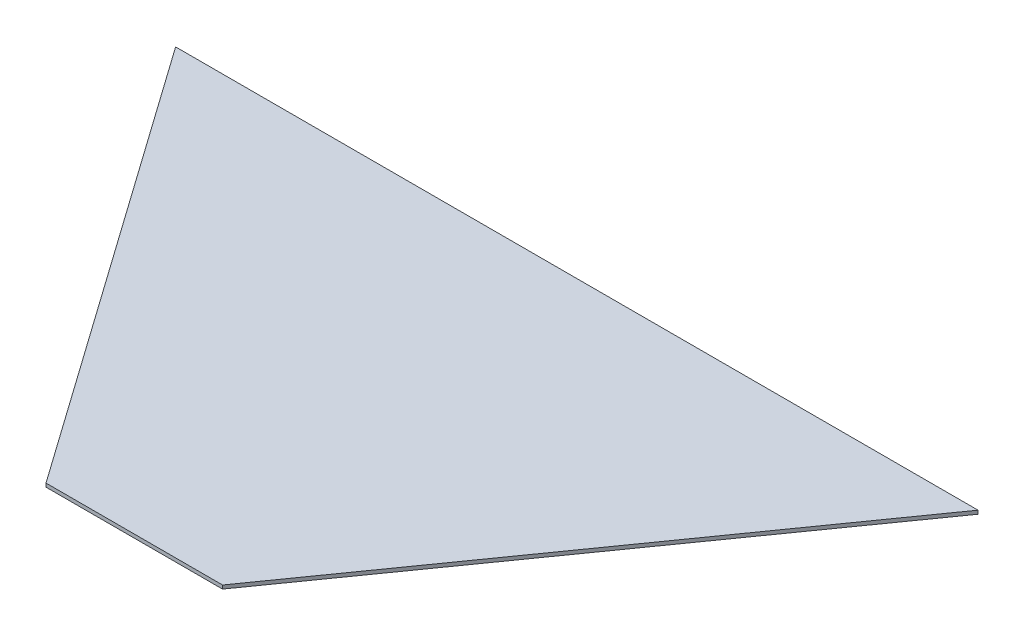
ISO-10303-21;
HEADER;
FILE_DESCRIPTION(('STEP AP214'),'2;1');
FILE_NAME('part.step','',(''),(''),'','','');
FILE_SCHEMA(('AUTOMOTIVE_DESIGN { 1 0 10303 214 1 1 1 1 }'));
ENDSEC;
DATA;
#1=APPLICATION_CONTEXT('core data for automotive mechanical design processes');
#2=APPLICATION_PROTOCOL_DEFINITION('international standard','automotive_design',2000,#1);
#3=PRODUCT_CONTEXT('',#1,'mechanical');
#4=PRODUCT('Part','Part','',(#3));
#5=PRODUCT_RELATED_PRODUCT_CATEGORY('part','',(#4));
#6=PRODUCT_DEFINITION_FORMATION('','',#4);
#7=PRODUCT_DEFINITION_CONTEXT('part definition',#1,'design');
#8=PRODUCT_DEFINITION('design','',#6,#7);
#9=PRODUCT_DEFINITION_SHAPE('','',#8);
#10=(LENGTH_UNIT() NAMED_UNIT(*) SI_UNIT(.MILLI.,.METRE.));
#11=(NAMED_UNIT(*) PLANE_ANGLE_UNIT() SI_UNIT($,.RADIAN.));
#12=(NAMED_UNIT(*) SI_UNIT($,.STERADIAN.) SOLID_ANGLE_UNIT());
#13=UNCERTAINTY_MEASURE_WITH_UNIT(LENGTH_MEASURE(1.E-05),#10,'distance_accuracy_value','');
#14=(GEOMETRIC_REPRESENTATION_CONTEXT(3) GLOBAL_UNCERTAINTY_ASSIGNED_CONTEXT((#13)) GLOBAL_UNIT_ASSIGNED_CONTEXT((#10,
#11,#12)) REPRESENTATION_CONTEXT('',''));
#15=CARTESIAN_POINT('',(0.,0.,0.));
#16=DIRECTION('',(0.,0.,1.));
#17=DIRECTION('',(1.,0.,0.));
#18=AXIS2_PLACEMENT_3D('',#15,#16,#17);
#19=CARTESIAN_POINT('',(168.110535,1.5,-185.436900746406));
#20=DIRECTION('',(-0.816496580927726,0.,-0.577350269189626));
#21=DIRECTION('',(-0.577350269189626,0.,0.816496580927726));
#22=AXIS2_PLACEMENT_3D('',#19,#20,#21);
#23=PLANE('',#22);
#24=DIRECTION('',(0.577350269189626,0.,-0.816496580927726));
#25=VECTOR('',#24,1.);
#26=CARTESIAN_POINT('',(168.110535,0.,-185.436900746406));
#27=LINE('',#26,#25);
#28=CARTESIAN_POINT('',(36.986845,0.,0.));
#29=VERTEX_POINT('',#28);
#30=CARTESIAN_POINT('',(168.110535,0.,-185.436900746406));
#31=VERTEX_POINT('',#30);
#32=EDGE_CURVE('E110',#29,#31,#27,.T.);
#33=ORIENTED_EDGE('',*,*,#32,.T.);
#34=DIRECTION('',(0.,-1.,0.));
#35=VECTOR('',#34,1.);
#36=CARTESIAN_POINT('',(168.110535,1.5,-185.436900746406));
#37=LINE('',#36,#35);
#38=CARTESIAN_POINT('',(168.110535,1.5,-185.436900746406));
#39=VERTEX_POINT('',#38);
#40=EDGE_CURVE('E11',#39,#31,#37,.T.);
#41=ORIENTED_EDGE('',*,*,#40,.F.);
#42=DIRECTION('',(0.577350269189626,0.,-0.816496580927726));
#43=VECTOR('',#42,1.);
#44=CARTESIAN_POINT('',(168.110535,1.5,-185.436900746406));
#45=LINE('',#44,#43);
#46=CARTESIAN_POINT('',(36.986845,1.5,0.));
#47=VERTEX_POINT('',#46);
#48=EDGE_CURVE('E93',#47,#39,#45,.T.);
#49=ORIENTED_EDGE('',*,*,#48,.F.);
#50=DIRECTION('',(0.,-1.,0.));
#51=VECTOR('',#50,1.);
#52=CARTESIAN_POINT('',(36.986845,1.5,0.));
#53=LINE('',#52,#51);
#54=EDGE_CURVE('E106',#47,#29,#53,.T.);
#55=ORIENTED_EDGE('',*,*,#54,.T.);
#56=EDGE_LOOP('',(#33,#41,#49,#55));
#57=FACE_BOUND('',#56,.T.);
#58=ADVANCED_FACE('F41',(#57),#23,.F.);
#59=CARTESIAN_POINT('',(168.110535,1.5,-185.436900746406));
#60=DIRECTION('',(0.,0.,1.));
#61=DIRECTION('',(1.,0.,0.));
#62=AXIS2_PLACEMENT_3D('',#59,#60,#61);
#63=PLANE('',#62);
#64=DIRECTION('',(-1.,0.,0.));
#65=VECTOR('',#64,1.);
#66=CARTESIAN_POINT('',(168.110535,0.,-185.436900746406));
#67=LINE('',#66,#65);
#68=CARTESIAN_POINT('',(-168.110535,0.,-185.436900746405));
#69=VERTEX_POINT('',#68);
#70=EDGE_CURVE('E98',#31,#69,#67,.T.);
#71=ORIENTED_EDGE('',*,*,#70,.T.);
#72=DIRECTION('',(0.,-1.,0.));
#73=VECTOR('',#72,1.);
#74=CARTESIAN_POINT('',(-168.110535,1.5,-185.436900746405));
#75=LINE('',#74,#73);
#76=CARTESIAN_POINT('',(-168.110535,1.5,-185.436900746405));
#77=VERTEX_POINT('',#76);
#78=EDGE_CURVE('E50',#77,#69,#75,.T.);
#79=ORIENTED_EDGE('',*,*,#78,.F.);
#80=DIRECTION('',(-1.,0.,0.));
#81=VECTOR('',#80,1.);
#82=CARTESIAN_POINT('',(168.110535,1.5,-185.436900746406));
#83=LINE('',#82,#81);
#84=EDGE_CURVE('E88',#39,#77,#83,.T.);
#85=ORIENTED_EDGE('',*,*,#84,.F.);
#86=ORIENTED_EDGE('',*,*,#40,.T.);
#87=EDGE_LOOP('',(#71,#79,#85,#86));
#88=FACE_BOUND('',#87,.T.);
#89=ADVANCED_FACE('F97',(#88),#63,.F.);
#90=CARTESIAN_POINT('',(-168.110535,1.5,-185.436900746405));
#91=DIRECTION('',(0.816496580927726,0.,-0.577350269189626));
#92=DIRECTION('',(-0.577350269189626,0.,-0.816496580927726));
#93=AXIS2_PLACEMENT_3D('',#90,#91,#92);
#94=PLANE('',#93);
#95=DIRECTION('',(0.577350269189626,0.,0.816496580927726));
#96=VECTOR('',#95,1.);
#97=CARTESIAN_POINT('',(-168.110535,0.,-185.436900746405));
#98=LINE('',#97,#96);
#99=CARTESIAN_POINT('',(-36.986845,0.,0.));
#100=VERTEX_POINT('',#99);
#101=EDGE_CURVE('E75',#69,#100,#98,.T.);
#102=ORIENTED_EDGE('',*,*,#101,.T.);
#103=DIRECTION('',(0.,-1.,0.));
#104=VECTOR('',#103,1.);
#105=CARTESIAN_POINT('',(-36.986845,1.5,0.));
#106=LINE('',#105,#104);
#107=CARTESIAN_POINT('',(-36.986845,1.5,0.));
#108=VERTEX_POINT('',#107);
#109=EDGE_CURVE('E100',#108,#100,#106,.T.);
#110=ORIENTED_EDGE('',*,*,#109,.F.);
#111=DIRECTION('',(0.577350269189626,0.,0.816496580927726));
#112=VECTOR('',#111,1.);
#113=CARTESIAN_POINT('',(-168.110535,1.5,-185.436900746405));
#114=LINE('',#113,#112);
#115=EDGE_CURVE('E91',#77,#108,#114,.T.);
#116=ORIENTED_EDGE('',*,*,#115,.F.);
#117=ORIENTED_EDGE('',*,*,#78,.T.);
#118=EDGE_LOOP('',(#102,#110,#116,#117));
#119=FACE_BOUND('',#118,.T.);
#120=ADVANCED_FACE('F101',(#119),#94,.F.);
#121=CARTESIAN_POINT('',(36.986845,1.5,0.));
#122=DIRECTION('',(0.,0.,-1.));
#123=DIRECTION('',(-1.,0.,0.));
#124=AXIS2_PLACEMENT_3D('',#121,#122,#123);
#125=PLANE('',#124);
#126=DIRECTION('',(1.,0.,0.));
#127=VECTOR('',#126,1.);
#128=CARTESIAN_POINT('',(36.986845,0.,0.));
#129=LINE('',#128,#127);
#130=EDGE_CURVE('E81',#100,#29,#129,.T.);
#131=ORIENTED_EDGE('',*,*,#130,.T.);
#132=ORIENTED_EDGE('',*,*,#54,.F.);
#133=DIRECTION('',(1.,0.,0.));
#134=VECTOR('',#133,1.);
#135=CARTESIAN_POINT('',(36.986845,1.5,0.));
#136=LINE('',#135,#134);
#137=EDGE_CURVE('E58',#108,#47,#136,.T.);
#138=ORIENTED_EDGE('',*,*,#137,.F.);
#139=ORIENTED_EDGE('',*,*,#109,.T.);
#140=EDGE_LOOP('',(#131,#132,#138,#139));
#141=FACE_BOUND('',#140,.T.);
#142=ADVANCED_FACE('F124',(#141),#125,.F.);
#143=CARTESIAN_POINT('',(0.,1.5,0.));
#144=DIRECTION('',(0.,1.,0.));
#145=DIRECTION('',(0.,0.,1.));
#146=AXIS2_PLACEMENT_3D('',#143,#144,#145);
#147=PLANE('',#146);
#148=ORIENTED_EDGE('',*,*,#48,.T.);
#149=ORIENTED_EDGE('',*,*,#84,.T.);
#150=ORIENTED_EDGE('',*,*,#115,.T.);
#151=ORIENTED_EDGE('',*,*,#137,.T.);
#152=EDGE_LOOP('',(#148,#149,#150,#151));
#153=FACE_BOUND('',#152,.T.);
#154=ADVANCED_FACE('F89',(#153),#147,.T.);
#155=CARTESIAN_POINT('',(0.,0.,0.));
#156=DIRECTION('',(0.,1.,0.));
#157=DIRECTION('',(0.,0.,1.));
#158=AXIS2_PLACEMENT_3D('',#155,#156,#157);
#159=PLANE('',#158);
#160=ORIENTED_EDGE('',*,*,#32,.F.);
#161=ORIENTED_EDGE('',*,*,#130,.F.);
#162=ORIENTED_EDGE('',*,*,#101,.F.);
#163=ORIENTED_EDGE('',*,*,#70,.F.);
#164=EDGE_LOOP('',(#160,#161,#162,#163));
#165=FACE_BOUND('',#164,.T.);
#166=ADVANCED_FACE('F127',(#165),#159,.F.);
#167=CLOSED_SHELL('',(#58,#89,#120,#142,#154,#166));
#168=MANIFOLD_SOLID_BREP('B2',#167);
#169=ADVANCED_BREP_SHAPE_REPRESENTATION('',(#18,#168),#14);
#170=SHAPE_DEFINITION_REPRESENTATION(#9,#169);
ENDSEC;
END-ISO-10303-21;
